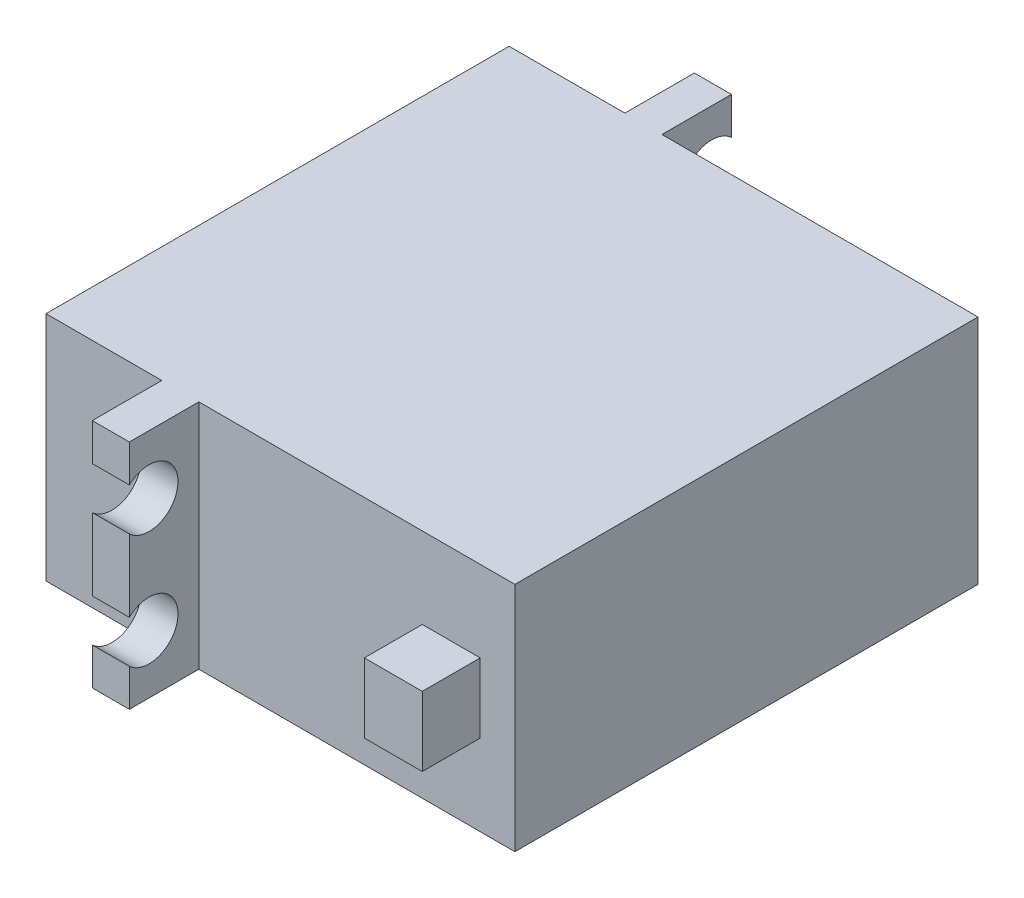
ISO-10303-21;
HEADER;
FILE_DESCRIPTION(('STEP AP214'),'2;1');
FILE_NAME('part.step','',(''),(''),'','','');
FILE_SCHEMA(('AUTOMOTIVE_DESIGN { 1 0 10303 214 1 1 1 1 }'));
ENDSEC;
DATA;
#1=APPLICATION_CONTEXT('core data for automotive mechanical design processes');
#2=APPLICATION_PROTOCOL_DEFINITION('international standard','automotive_design',2000,#1);
#3=PRODUCT_CONTEXT('',#1,'mechanical');
#4=PRODUCT('Part','Part','',(#3));
#5=PRODUCT_RELATED_PRODUCT_CATEGORY('part','',(#4));
#6=PRODUCT_DEFINITION_FORMATION('','',#4);
#7=PRODUCT_DEFINITION_CONTEXT('part definition',#1,'design');
#8=PRODUCT_DEFINITION('design','',#6,#7);
#9=PRODUCT_DEFINITION_SHAPE('','',#8);
#10=(LENGTH_UNIT() NAMED_UNIT(*) SI_UNIT(.MILLI.,.METRE.));
#11=(NAMED_UNIT(*) PLANE_ANGLE_UNIT() SI_UNIT($,.RADIAN.));
#12=(NAMED_UNIT(*) SI_UNIT($,.STERADIAN.) SOLID_ANGLE_UNIT());
#13=UNCERTAINTY_MEASURE_WITH_UNIT(LENGTH_MEASURE(1.E-05),#10,'distance_accuracy_value','');
#14=(GEOMETRIC_REPRESENTATION_CONTEXT(3) GLOBAL_UNCERTAINTY_ASSIGNED_CONTEXT((#13)) GLOBAL_UNIT_ASSIGNED_CONTEXT((#10,
#11,#12)) REPRESENTATION_CONTEXT('',''));
#15=CARTESIAN_POINT('',(0.,0.,0.));
#16=DIRECTION('',(0.,0.,1.));
#17=DIRECTION('',(1.,0.,0.));
#18=AXIS2_PLACEMENT_3D('',#15,#16,#17);
#19=CARTESIAN_POINT('',(-20.25,0.,20.));
#20=DIRECTION('',(0.,0.,-1.));
#21=DIRECTION('',(-1.,0.,0.));
#22=AXIS2_PLACEMENT_3D('',#19,#20,#21);
#23=PLANE('',#22);
#24=DIRECTION('',(0.,1.,0.));
#25=VECTOR('',#24,1.);
#26=CARTESIAN_POINT('',(-7.04999999999999,0.,20.));
#27=LINE('',#26,#25);
#28=CARTESIAN_POINT('',(-7.04999999999999,-10.,20.));
#29=VERTEX_POINT('',#28);
#30=CARTESIAN_POINT('',(-7.04999999999999,10.,20.));
#31=VERTEX_POINT('',#30);
#32=EDGE_CURVE('E311',#29,#31,#27,.T.);
#33=ORIENTED_EDGE('',*,*,#32,.F.);
#34=DIRECTION('',(1.,0.,0.));
#35=VECTOR('',#34,1.);
#36=CARTESIAN_POINT('',(-20.25,-10.,20.));
#37=LINE('',#36,#35);
#38=CARTESIAN_POINT('',(20.25,-10.,20.));
#39=VERTEX_POINT('',#38);
#40=EDGE_CURVE('E46',#29,#39,#37,.T.);
#41=ORIENTED_EDGE('',*,*,#40,.T.);
#42=DIRECTION('',(0.,1.,0.));
#43=VECTOR('',#42,1.);
#44=CARTESIAN_POINT('',(20.25,0.,20.));
#45=LINE('',#44,#43);
#46=CARTESIAN_POINT('',(20.25,10.,20.));
#47=VERTEX_POINT('',#46);
#48=EDGE_CURVE('E337',#39,#47,#45,.T.);
#49=ORIENTED_EDGE('',*,*,#48,.T.);
#50=DIRECTION('',(1.,0.,0.));
#51=VECTOR('',#50,1.);
#52=CARTESIAN_POINT('',(-20.25,10.,20.));
#53=LINE('',#52,#51);
#54=EDGE_CURVE('E357',#31,#47,#53,.T.);
#55=ORIENTED_EDGE('',*,*,#54,.F.);
#56=EDGE_LOOP('',(#33,#41,#49,#55));
#57=FACE_BOUND('',#56,.T.);
#58=DIRECTION('',(0.,-1.,0.));
#59=VECTOR('',#58,1.);
#60=CARTESIAN_POINT('',(12.25,3.,20.));
#61=LINE('',#60,#59);
#62=CARTESIAN_POINT('',(12.25,3.,20.));
#63=VERTEX_POINT('',#62);
#64=CARTESIAN_POINT('',(12.25,-3.,20.));
#65=VERTEX_POINT('',#64);
#66=EDGE_CURVE('E220',#63,#65,#61,.T.);
#67=ORIENTED_EDGE('',*,*,#66,.F.);
#68=DIRECTION('',(-1.,0.,0.));
#69=VECTOR('',#68,1.);
#70=CARTESIAN_POINT('',(12.25,3.,20.));
#71=LINE('',#70,#69);
#72=CARTESIAN_POINT('',(17.25,3.,20.));
#73=VERTEX_POINT('',#72);
#74=EDGE_CURVE('E217',#73,#63,#71,.T.);
#75=ORIENTED_EDGE('',*,*,#74,.F.);
#76=DIRECTION('',(0.,1.,0.));
#77=VECTOR('',#76,1.);
#78=CARTESIAN_POINT('',(17.25,3.,20.));
#79=LINE('',#78,#77);
#80=CARTESIAN_POINT('',(17.25,-3.,20.));
#81=VERTEX_POINT('',#80);
#82=EDGE_CURVE('E59',#81,#73,#79,.T.);
#83=ORIENTED_EDGE('',*,*,#82,.F.);
#84=DIRECTION('',(1.,0.,0.));
#85=VECTOR('',#84,1.);
#86=CARTESIAN_POINT('',(12.25,-3.,20.));
#87=LINE('',#86,#85);
#88=EDGE_CURVE('E54',#65,#81,#87,.T.);
#89=ORIENTED_EDGE('',*,*,#88,.F.);
#90=EDGE_LOOP('',(#67,#75,#83,#89));
#91=FACE_BOUND('',#90,.T.);
#92=ADVANCED_FACE('F37',(#57,#91),#23,.F.);
#93=CARTESIAN_POINT('',(-20.25,0.,-20.));
#94=DIRECTION('',(0.,0.,-1.));
#95=DIRECTION('',(-1.,0.,0.));
#96=AXIS2_PLACEMENT_3D('',#93,#94,#95);
#97=PLANE('',#96);
#98=DIRECTION('',(1.,0.,0.));
#99=VECTOR('',#98,1.);
#100=CARTESIAN_POINT('',(-20.25,-10.,-20.));
#101=LINE('',#100,#99);
#102=CARTESIAN_POINT('',(-7.04999999999999,-10.,-20.));
#103=VERTEX_POINT('',#102);
#104=CARTESIAN_POINT('',(20.25,-10.,-20.));
#105=VERTEX_POINT('',#104);
#106=EDGE_CURVE('E344',#103,#105,#101,.T.);
#107=ORIENTED_EDGE('',*,*,#106,.F.);
#108=DIRECTION('',(0.,1.,0.));
#109=VECTOR('',#108,1.);
#110=CARTESIAN_POINT('',(-7.04999999999999,0.,-20.));
#111=LINE('',#110,#109);
#112=CARTESIAN_POINT('',(-7.04999999999999,10.,-20.));
#113=VERTEX_POINT('',#112);
#114=EDGE_CURVE('E266',#103,#113,#111,.T.);
#115=ORIENTED_EDGE('',*,*,#114,.T.);
#116=DIRECTION('',(1.,0.,0.));
#117=VECTOR('',#116,1.);
#118=CARTESIAN_POINT('',(-20.25,10.,-20.));
#119=LINE('',#118,#117);
#120=CARTESIAN_POINT('',(20.25,10.,-20.));
#121=VERTEX_POINT('',#120);
#122=EDGE_CURVE('E359',#113,#121,#119,.T.);
#123=ORIENTED_EDGE('',*,*,#122,.T.);
#124=DIRECTION('',(0.,1.,0.));
#125=VECTOR('',#124,1.);
#126=CARTESIAN_POINT('',(20.25,0.,-20.));
#127=LINE('',#126,#125);
#128=EDGE_CURVE('E347',#105,#121,#127,.T.);
#129=ORIENTED_EDGE('',*,*,#128,.F.);
#130=EDGE_LOOP('',(#107,#115,#123,#129));
#131=FACE_BOUND('',#130,.T.);
#132=ADVANCED_FACE('F370',(#131),#97,.T.);
#133=CARTESIAN_POINT('',(-20.25,-10.,0.));
#134=DIRECTION('',(0.,-1.,0.));
#135=DIRECTION('',(0.,0.,-1.));
#136=AXIS2_PLACEMENT_3D('',#133,#134,#135);
#137=PLANE('',#136);
#138=DIRECTION('',(0.,0.,-1.));
#139=VECTOR('',#138,1.);
#140=CARTESIAN_POINT('',(20.25,-10.,0.));
#141=LINE('',#140,#139);
#142=EDGE_CURVE('E322',#39,#105,#141,.T.);
#143=ORIENTED_EDGE('',*,*,#142,.F.);
#144=ORIENTED_EDGE('',*,*,#40,.F.);
#145=DIRECTION('',(0.,0.,-1.));
#146=VECTOR('',#145,1.);
#147=CARTESIAN_POINT('',(-7.04999999999999,-10.,0.));
#148=LINE('',#147,#146);
#149=CARTESIAN_POINT('',(-7.04999999999999,-10.,26.));
#150=VERTEX_POINT('',#149);
#151=EDGE_CURVE('E308',#150,#29,#148,.T.);
#152=ORIENTED_EDGE('',*,*,#151,.F.);
#153=DIRECTION('',(1.,0.,0.));
#154=VECTOR('',#153,1.);
#155=CARTESIAN_POINT('',(-10.25,-10.,26.));
#156=LINE('',#155,#154);
#157=CARTESIAN_POINT('',(-10.25,-10.,26.));
#158=VERTEX_POINT('',#157);
#159=EDGE_CURVE('E329',#158,#150,#156,.T.);
#160=ORIENTED_EDGE('',*,*,#159,.F.);
#161=DIRECTION('',(0.,0.,-1.));
#162=VECTOR('',#161,1.);
#163=CARTESIAN_POINT('',(-10.25,-10.,0.));
#164=LINE('',#163,#162);
#165=CARTESIAN_POINT('',(-10.25,-10.,20.));
#166=VERTEX_POINT('',#165);
#167=EDGE_CURVE('E290',#158,#166,#164,.T.);
#168=ORIENTED_EDGE('',*,*,#167,.T.);
#169=CARTESIAN_POINT('',(-20.25,-10.,20.));
#170=VERTEX_POINT('',#169);
#171=EDGE_CURVE('E11',#170,#166,#37,.T.);
#172=ORIENTED_EDGE('',*,*,#171,.F.);
#173=DIRECTION('',(0.,0.,-1.));
#174=VECTOR('',#173,1.);
#175=CARTESIAN_POINT('',(-20.25,-10.,0.));
#176=LINE('',#175,#174);
#177=CARTESIAN_POINT('',(-20.25,-10.,-20.));
#178=VERTEX_POINT('',#177);
#179=EDGE_CURVE('E333',#170,#178,#176,.T.);
#180=ORIENTED_EDGE('',*,*,#179,.T.);
#181=CARTESIAN_POINT('',(-10.25,-10.,-20.));
#182=VERTEX_POINT('',#181);
#183=EDGE_CURVE('E41',#178,#182,#101,.T.);
#184=ORIENTED_EDGE('',*,*,#183,.T.);
#185=DIRECTION('',(0.,0.,1.));
#186=VECTOR('',#185,1.);
#187=CARTESIAN_POINT('',(-10.25,-9.99999999999999,0.));
#188=LINE('',#187,#186);
#189=CARTESIAN_POINT('',(-10.25,-10.,-26.));
#190=VERTEX_POINT('',#189);
#191=EDGE_CURVE('E250',#190,#182,#188,.T.);
#192=ORIENTED_EDGE('',*,*,#191,.F.);
#193=DIRECTION('',(1.,0.,0.));
#194=VECTOR('',#193,1.);
#195=CARTESIAN_POINT('',(-10.25,-10.,-26.));
#196=LINE('',#195,#194);
#197=CARTESIAN_POINT('',(-7.04999999999999,-10.,-26.));
#198=VERTEX_POINT('',#197);
#199=EDGE_CURVE('E270',#190,#198,#196,.T.);
#200=ORIENTED_EDGE('',*,*,#199,.T.);
#201=DIRECTION('',(0.,0.,1.));
#202=VECTOR('',#201,1.);
#203=CARTESIAN_POINT('',(-7.04999999999999,-9.99999999999999,0.));
#204=LINE('',#203,#202);
#205=EDGE_CURVE('E237',#198,#103,#204,.T.);
#206=ORIENTED_EDGE('',*,*,#205,.T.);
#207=ORIENTED_EDGE('',*,*,#106,.T.);
#208=EDGE_LOOP('',(#143,#144,#152,#160,#168,#172,#180,#184,#192,#200,#206,#207));
#209=FACE_BOUND('',#208,.T.);
#210=ADVANCED_FACE('F39',(#209),#137,.T.);
#211=ORIENTED_EDGE('',*,*,#171,.T.);
#212=DIRECTION('',(0.,1.,0.));
#213=VECTOR('',#212,1.);
#214=CARTESIAN_POINT('',(-10.25,0.,20.));
#215=LINE('',#214,#213);
#216=CARTESIAN_POINT('',(-10.25,10.,20.));
#217=VERTEX_POINT('',#216);
#218=EDGE_CURVE('E295',#166,#217,#215,.T.);
#219=ORIENTED_EDGE('',*,*,#218,.T.);
#220=CARTESIAN_POINT('',(-20.25,10.,20.));
#221=VERTEX_POINT('',#220);
#222=EDGE_CURVE('E355',#221,#217,#53,.T.);
#223=ORIENTED_EDGE('',*,*,#222,.F.);
#224=DIRECTION('',(0.,1.,0.));
#225=VECTOR('',#224,1.);
#226=CARTESIAN_POINT('',(-20.25,0.,20.));
#227=LINE('',#226,#225);
#228=EDGE_CURVE('E342',#170,#221,#227,.T.);
#229=ORIENTED_EDGE('',*,*,#228,.F.);
#230=EDGE_LOOP('',(#211,#219,#223,#229));
#231=FACE_BOUND('',#230,.T.);
#232=ADVANCED_FACE('F395',(#231),#23,.F.);
#233=CARTESIAN_POINT('',(-20.25,10.,0.));
#234=DIRECTION('',(0.,-1.,0.));
#235=DIRECTION('',(0.,0.,-1.));
#236=AXIS2_PLACEMENT_3D('',#233,#234,#235);
#237=PLANE('',#236);
#238=DIRECTION('',(0.,0.,-1.));
#239=VECTOR('',#238,1.);
#240=CARTESIAN_POINT('',(20.25,10.,0.));
#241=LINE('',#240,#239);
#242=EDGE_CURVE('E350',#47,#121,#241,.T.);
#243=ORIENTED_EDGE('',*,*,#242,.T.);
#244=ORIENTED_EDGE('',*,*,#122,.F.);
#245=DIRECTION('',(0.,0.,-1.));
#246=VECTOR('',#245,1.);
#247=CARTESIAN_POINT('',(-7.04999999999999,10.,0.));
#248=LINE('',#247,#246);
#249=CARTESIAN_POINT('',(-7.04999999999999,10.,-26.));
#250=VERTEX_POINT('',#249);
#251=EDGE_CURVE('E264',#113,#250,#248,.T.);
#252=ORIENTED_EDGE('',*,*,#251,.T.);
#253=DIRECTION('',(1.,0.,0.));
#254=VECTOR('',#253,1.);
#255=CARTESIAN_POINT('',(-10.25,10.,-26.));
#256=LINE('',#255,#254);
#257=CARTESIAN_POINT('',(-10.25,10.,-26.));
#258=VERTEX_POINT('',#257);
#259=EDGE_CURVE('E274',#258,#250,#256,.T.);
#260=ORIENTED_EDGE('',*,*,#259,.F.);
#261=DIRECTION('',(0.,0.,-1.));
#262=VECTOR('',#261,1.);
#263=CARTESIAN_POINT('',(-10.25,10.,0.));
#264=LINE('',#263,#262);
#265=CARTESIAN_POINT('',(-10.25,10.,-20.));
#266=VERTEX_POINT('',#265);
#267=EDGE_CURVE('E245',#266,#258,#264,.T.);
#268=ORIENTED_EDGE('',*,*,#267,.F.);
#269=CARTESIAN_POINT('',(-20.25,10.,-20.));
#270=VERTEX_POINT('',#269);
#271=EDGE_CURVE('E358',#270,#266,#119,.T.);
#272=ORIENTED_EDGE('',*,*,#271,.F.);
#273=DIRECTION('',(0.,0.,-1.));
#274=VECTOR('',#273,1.);
#275=CARTESIAN_POINT('',(-20.25,10.,0.));
#276=LINE('',#275,#274);
#277=EDGE_CURVE('E340',#221,#270,#276,.T.);
#278=ORIENTED_EDGE('',*,*,#277,.F.);
#279=ORIENTED_EDGE('',*,*,#222,.T.);
#280=DIRECTION('',(0.,0.,1.));
#281=VECTOR('',#280,1.);
#282=CARTESIAN_POINT('',(-10.25,10.,0.));
#283=LINE('',#282,#281);
#284=CARTESIAN_POINT('',(-10.25,10.,26.));
#285=VERTEX_POINT('',#284);
#286=EDGE_CURVE('E298',#217,#285,#283,.T.);
#287=ORIENTED_EDGE('',*,*,#286,.T.);
#288=DIRECTION('',(1.,0.,0.));
#289=VECTOR('',#288,1.);
#290=CARTESIAN_POINT('',(-10.25,10.,26.));
#291=LINE('',#290,#289);
#292=CARTESIAN_POINT('',(-7.04999999999999,10.,26.));
#293=VERTEX_POINT('',#292);
#294=EDGE_CURVE('E327',#285,#293,#291,.T.);
#295=ORIENTED_EDGE('',*,*,#294,.T.);
#296=DIRECTION('',(0.,0.,1.));
#297=VECTOR('',#296,1.);
#298=CARTESIAN_POINT('',(-7.04999999999999,10.,0.));
#299=LINE('',#298,#297);
#300=EDGE_CURVE('E314',#31,#293,#299,.T.);
#301=ORIENTED_EDGE('',*,*,#300,.F.);
#302=ORIENTED_EDGE('',*,*,#54,.T.);
#303=EDGE_LOOP('',(#243,#244,#252,#260,#268,#272,#278,#279,#287,#295,#301,#302));
#304=FACE_BOUND('',#303,.T.);
#305=ADVANCED_FACE('F408',(#304),#237,.F.);
#306=DIRECTION('',(0.,1.,0.));
#307=VECTOR('',#306,1.);
#308=CARTESIAN_POINT('',(-10.25,0.,-20.));
#309=LINE('',#308,#307);
#310=EDGE_CURVE('E247',#182,#266,#309,.T.);
#311=ORIENTED_EDGE('',*,*,#310,.F.);
#312=ORIENTED_EDGE('',*,*,#183,.F.);
#313=DIRECTION('',(0.,1.,0.));
#314=VECTOR('',#313,1.);
#315=CARTESIAN_POINT('',(-20.25,0.,-20.));
#316=LINE('',#315,#314);
#317=EDGE_CURVE('E336',#178,#270,#316,.T.);
#318=ORIENTED_EDGE('',*,*,#317,.T.);
#319=ORIENTED_EDGE('',*,*,#271,.T.);
#320=EDGE_LOOP('',(#311,#312,#318,#319));
#321=FACE_BOUND('',#320,.T.);
#322=ADVANCED_FACE('F402',(#321),#97,.T.);
#323=CARTESIAN_POINT('',(-20.25,0.,0.));
#324=DIRECTION('',(1.,0.,0.));
#325=DIRECTION('',(0.,0.,-1.));
#326=AXIS2_PLACEMENT_3D('',#323,#324,#325);
#327=PLANE('',#326);
#328=CARTESIAN_POINT('',(-20.25,0.,10.2));
#329=DIRECTION('',(1.,0.,0.));
#330=DIRECTION('',(0.,0.,-1.));
#331=AXIS2_PLACEMENT_3D('',#328,#329,#330);
#332=CIRCLE('',#331,3.);
#333=CARTESIAN_POINT('',(-20.25,0.,7.2));
#334=VERTEX_POINT('',#333);
#335=EDGE_CURVE('E221',#334,#334,#332,.T.);
#336=ORIENTED_EDGE('',*,*,#335,.T.);
#337=EDGE_LOOP('',(#336));
#338=FACE_BOUND('',#337,.T.);
#339=ORIENTED_EDGE('',*,*,#179,.F.);
#340=ORIENTED_EDGE('',*,*,#228,.T.);
#341=ORIENTED_EDGE('',*,*,#277,.T.);
#342=ORIENTED_EDGE('',*,*,#317,.F.);
#343=EDGE_LOOP('',(#339,#340,#341,#342));
#344=FACE_BOUND('',#343,.T.);
#345=ADVANCED_FACE('F401',(#338,#344),#327,.F.);
#346=CARTESIAN_POINT('',(20.25,0.,0.));
#347=DIRECTION('',(1.,0.,0.));
#348=DIRECTION('',(0.,0.,-1.));
#349=AXIS2_PLACEMENT_3D('',#346,#347,#348);
#350=PLANE('',#349);
#351=ORIENTED_EDGE('',*,*,#142,.T.);
#352=ORIENTED_EDGE('',*,*,#128,.T.);
#353=ORIENTED_EDGE('',*,*,#242,.F.);
#354=ORIENTED_EDGE('',*,*,#48,.F.);
#355=EDGE_LOOP('',(#351,#352,#353,#354));
#356=FACE_BOUND('',#355,.T.);
#357=ADVANCED_FACE('F374',(#356),#350,.T.);
#358=CARTESIAN_POINT('',(-10.25,-4.95,24.3));
#359=DIRECTION('',(1.,0.,0.));
#360=DIRECTION('',(0.,0.,-1.));
#361=AXIS2_PLACEMENT_3D('',#358,#359,#360);
#362=CYLINDRICAL_SURFACE('',#361,2.5);
#363=CARTESIAN_POINT('',(-7.04999999999999,-4.95,24.3));
#364=DIRECTION('',(1.,0.,0.));
#365=DIRECTION('',(0.,0.,-1.));
#366=AXIS2_PLACEMENT_3D('',#363,#364,#365);
#367=CIRCLE('',#366,2.5);
#368=CARTESIAN_POINT('',(-7.04999999999999,-6.78303027798233,26.));
#369=VERTEX_POINT('',#368);
#370=CARTESIAN_POINT('',(-7.04999999999999,-3.11696972201767,26.));
#371=VERTEX_POINT('',#370);
#372=EDGE_CURVE('E273',#369,#371,#367,.T.);
#373=ORIENTED_EDGE('',*,*,#372,.T.);
#374=DIRECTION('',(1.,0.,0.));
#375=VECTOR('',#374,1.);
#376=CARTESIAN_POINT('',(-10.25,-3.11696972201767,26.));
#377=LINE('',#376,#375);
#378=CARTESIAN_POINT('',(-10.25,-3.11696972201767,26.));
#379=VERTEX_POINT('',#378);
#380=EDGE_CURVE('E320',#379,#371,#377,.T.);
#381=ORIENTED_EDGE('',*,*,#380,.F.);
#382=CARTESIAN_POINT('',(-10.25,-4.95,24.3));
#383=DIRECTION('',(1.,0.,0.));
#384=DIRECTION('',(0.,0.,-1.));
#385=AXIS2_PLACEMENT_3D('',#382,#383,#384);
#386=CIRCLE('',#385,2.5);
#387=CARTESIAN_POINT('',(-10.25,-6.78303027798233,26.));
#388=VERTEX_POINT('',#387);
#389=EDGE_CURVE('E284',#388,#379,#386,.T.);
#390=ORIENTED_EDGE('',*,*,#389,.F.);
#391=DIRECTION('',(1.,0.,0.));
#392=VECTOR('',#391,1.);
#393=CARTESIAN_POINT('',(-10.25,-6.78303027798233,26.));
#394=LINE('',#393,#392);
#395=EDGE_CURVE('E331',#388,#369,#394,.T.);
#396=ORIENTED_EDGE('',*,*,#395,.T.);
#397=EDGE_LOOP('',(#373,#381,#390,#396));
#398=FACE_BOUND('',#397,.T.);
#399=ADVANCED_FACE('F444',(#398),#362,.F.);
#400=CARTESIAN_POINT('',(-10.25,0.,26.));
#401=DIRECTION('',(0.,0.,1.));
#402=DIRECTION('',(0.,-1.,0.));
#403=AXIS2_PLACEMENT_3D('',#400,#401,#402);
#404=PLANE('',#403);
#405=DIRECTION('',(0.,-1.,0.));
#406=VECTOR('',#405,1.);
#407=CARTESIAN_POINT('',(-7.04999999999999,0.,26.));
#408=LINE('',#407,#406);
#409=CARTESIAN_POINT('',(-7.04999999999999,3.11696972201767,26.));
#410=VERTEX_POINT('',#409);
#411=EDGE_CURVE('E287',#410,#371,#408,.T.);
#412=ORIENTED_EDGE('',*,*,#411,.F.);
#413=DIRECTION('',(1.,0.,0.));
#414=VECTOR('',#413,1.);
#415=CARTESIAN_POINT('',(-10.25,3.11696972201767,26.));
#416=LINE('',#415,#414);
#417=CARTESIAN_POINT('',(-10.25,3.11696972201767,26.));
#418=VERTEX_POINT('',#417);
#419=EDGE_CURVE('E323',#418,#410,#416,.T.);
#420=ORIENTED_EDGE('',*,*,#419,.F.);
#421=DIRECTION('',(0.,-1.,0.));
#422=VECTOR('',#421,1.);
#423=CARTESIAN_POINT('',(-10.25,0.,26.));
#424=LINE('',#423,#422);
#425=EDGE_CURVE('E291',#418,#379,#424,.T.);
#426=ORIENTED_EDGE('',*,*,#425,.T.);
#427=ORIENTED_EDGE('',*,*,#380,.T.);
#428=EDGE_LOOP('',(#412,#420,#426,#427));
#429=FACE_BOUND('',#428,.T.);
#430=ADVANCED_FACE('F440',(#429),#404,.T.);
#431=CARTESIAN_POINT('',(-10.25,4.95,24.3));
#432=DIRECTION('',(1.,0.,0.));
#433=DIRECTION('',(0.,0.,-1.));
#434=AXIS2_PLACEMENT_3D('',#431,#432,#433);
#435=CYLINDRICAL_SURFACE('',#434,2.5);
#436=CARTESIAN_POINT('',(-7.04999999999999,4.95,24.3));
#437=DIRECTION('',(1.,0.,0.));
#438=DIRECTION('',(0.,0.,-1.));
#439=AXIS2_PLACEMENT_3D('',#436,#437,#438);
#440=CIRCLE('',#439,2.5);
#441=CARTESIAN_POINT('',(-7.04999999999999,6.78303027798234,26.));
#442=VERTEX_POINT('',#441);
#443=EDGE_CURVE('E317',#410,#442,#440,.T.);
#444=ORIENTED_EDGE('',*,*,#443,.T.);
#445=DIRECTION('',(1.,0.,0.));
#446=VECTOR('',#445,1.);
#447=CARTESIAN_POINT('',(-10.25,6.78303027798234,26.));
#448=LINE('',#447,#446);
#449=CARTESIAN_POINT('',(-10.25,6.78303027798234,26.));
#450=VERTEX_POINT('',#449);
#451=EDGE_CURVE('E325',#450,#442,#448,.T.);
#452=ORIENTED_EDGE('',*,*,#451,.F.);
#453=CARTESIAN_POINT('',(-10.25,4.95,24.3));
#454=DIRECTION('',(1.,0.,0.));
#455=DIRECTION('',(0.,0.,-1.));
#456=AXIS2_PLACEMENT_3D('',#453,#454,#455);
#457=CIRCLE('',#456,2.5);
#458=EDGE_CURVE('E301',#418,#450,#457,.T.);
#459=ORIENTED_EDGE('',*,*,#458,.F.);
#460=ORIENTED_EDGE('',*,*,#419,.T.);
#461=EDGE_LOOP('',(#444,#452,#459,#460));
#462=FACE_BOUND('',#461,.T.);
#463=ADVANCED_FACE('F451',(#462),#435,.F.);
#464=EDGE_CURVE('E309',#293,#442,#408,.T.);
#465=ORIENTED_EDGE('',*,*,#464,.F.);
#466=ORIENTED_EDGE('',*,*,#294,.F.);
#467=EDGE_CURVE('E292',#285,#450,#424,.T.);
#468=ORIENTED_EDGE('',*,*,#467,.T.);
#469=ORIENTED_EDGE('',*,*,#451,.T.);
#470=EDGE_LOOP('',(#465,#466,#468,#469));
#471=FACE_BOUND('',#470,.T.);
#472=ADVANCED_FACE('F453',(#471),#404,.T.);
#473=EDGE_CURVE('E305',#369,#150,#408,.T.);
#474=ORIENTED_EDGE('',*,*,#473,.F.);
#475=ORIENTED_EDGE('',*,*,#395,.F.);
#476=EDGE_CURVE('E286',#388,#158,#424,.T.);
#477=ORIENTED_EDGE('',*,*,#476,.T.);
#478=ORIENTED_EDGE('',*,*,#159,.T.);
#479=EDGE_LOOP('',(#474,#475,#477,#478));
#480=FACE_BOUND('',#479,.T.);
#481=ADVANCED_FACE('F386',(#480),#404,.T.);
#482=CARTESIAN_POINT('',(-10.25,0.,0.));
#483=DIRECTION('',(1.,0.,0.));
#484=DIRECTION('',(0.,0.,-1.));
#485=AXIS2_PLACEMENT_3D('',#482,#483,#484);
#486=PLANE('',#485);
#487=ORIENTED_EDGE('',*,*,#389,.T.);
#488=ORIENTED_EDGE('',*,*,#425,.F.);
#489=ORIENTED_EDGE('',*,*,#458,.T.);
#490=ORIENTED_EDGE('',*,*,#467,.F.);
#491=ORIENTED_EDGE('',*,*,#286,.F.);
#492=ORIENTED_EDGE('',*,*,#218,.F.);
#493=ORIENTED_EDGE('',*,*,#167,.F.);
#494=ORIENTED_EDGE('',*,*,#476,.F.);
#495=EDGE_LOOP('',(#487,#488,#489,#490,#491,#492,#493,#494));
#496=FACE_BOUND('',#495,.T.);
#497=ADVANCED_FACE('F390',(#496),#486,.F.);
#498=CARTESIAN_POINT('',(-7.04999999999999,0.,0.));
#499=DIRECTION('',(1.,0.,0.));
#500=DIRECTION('',(0.,0.,-1.));
#501=AXIS2_PLACEMENT_3D('',#498,#499,#500);
#502=PLANE('',#501);
#503=ORIENTED_EDGE('',*,*,#372,.F.);
#504=ORIENTED_EDGE('',*,*,#473,.T.);
#505=ORIENTED_EDGE('',*,*,#151,.T.);
#506=ORIENTED_EDGE('',*,*,#32,.T.);
#507=ORIENTED_EDGE('',*,*,#300,.T.);
#508=ORIENTED_EDGE('',*,*,#464,.T.);
#509=ORIENTED_EDGE('',*,*,#443,.F.);
#510=ORIENTED_EDGE('',*,*,#411,.T.);
#511=EDGE_LOOP('',(#503,#504,#505,#506,#507,#508,#509,#510));
#512=FACE_BOUND('',#511,.T.);
#513=ADVANCED_FACE('F383',(#512),#502,.T.);
#514=CARTESIAN_POINT('',(-10.25,0.,-26.));
#515=DIRECTION('',(0.,0.,1.));
#516=DIRECTION('',(0.,-1.,0.));
#517=AXIS2_PLACEMENT_3D('',#514,#515,#516);
#518=PLANE('',#517);
#519=DIRECTION('',(0.,-1.,0.));
#520=VECTOR('',#519,1.);
#521=CARTESIAN_POINT('',(-7.04999999999999,0.,-26.));
#522=LINE('',#521,#520);
#523=CARTESIAN_POINT('',(-7.04999999999999,-6.78303027798234,-26.));
#524=VERTEX_POINT('',#523);
#525=EDGE_CURVE('E231',#524,#198,#522,.T.);
#526=ORIENTED_EDGE('',*,*,#525,.T.);
#527=ORIENTED_EDGE('',*,*,#199,.F.);
#528=DIRECTION('',(0.,-1.,0.));
#529=VECTOR('',#528,1.);
#530=CARTESIAN_POINT('',(-10.25,0.,-26.));
#531=LINE('',#530,#529);
#532=CARTESIAN_POINT('',(-10.25,-6.78303027798234,-26.));
#533=VERTEX_POINT('',#532);
#534=EDGE_CURVE('E233',#533,#190,#531,.T.);
#535=ORIENTED_EDGE('',*,*,#534,.F.);
#536=DIRECTION('',(1.,0.,0.));
#537=VECTOR('',#536,1.);
#538=CARTESIAN_POINT('',(-10.25,-6.78303027798234,-26.));
#539=LINE('',#538,#537);
#540=EDGE_CURVE('E253',#533,#524,#539,.T.);
#541=ORIENTED_EDGE('',*,*,#540,.T.);
#542=EDGE_LOOP('',(#526,#527,#535,#541));
#543=FACE_BOUND('',#542,.T.);
#544=ADVANCED_FACE('F431',(#543),#518,.F.);
#545=CARTESIAN_POINT('',(-7.04999999999999,6.78303027798234,-26.));
#546=VERTEX_POINT('',#545);
#547=EDGE_CURVE('E257',#250,#546,#522,.T.);
#548=ORIENTED_EDGE('',*,*,#547,.T.);
#549=DIRECTION('',(1.,0.,0.));
#550=VECTOR('',#549,1.);
#551=CARTESIAN_POINT('',(-10.25,6.78303027798234,-26.));
#552=LINE('',#551,#550);
#553=CARTESIAN_POINT('',(-10.25,6.78303027798234,-26.));
#554=VERTEX_POINT('',#553);
#555=EDGE_CURVE('E277',#554,#546,#552,.T.);
#556=ORIENTED_EDGE('',*,*,#555,.F.);
#557=EDGE_CURVE('E238',#258,#554,#531,.T.);
#558=ORIENTED_EDGE('',*,*,#557,.F.);
#559=ORIENTED_EDGE('',*,*,#259,.T.);
#560=EDGE_LOOP('',(#548,#556,#558,#559));
#561=FACE_BOUND('',#560,.T.);
#562=ADVANCED_FACE('F415',(#561),#518,.F.);
#563=CARTESIAN_POINT('',(-10.25,4.95,-24.3));
#564=DIRECTION('',(1.,0.,0.));
#565=DIRECTION('',(0.,0.,-1.));
#566=AXIS2_PLACEMENT_3D('',#563,#564,#565);
#567=CYLINDRICAL_SURFACE('',#566,2.5);
#568=CARTESIAN_POINT('',(-7.04999999999999,4.95,-24.3));
#569=DIRECTION('',(1.,0.,0.));
#570=DIRECTION('',(0.,0.,-1.));
#571=AXIS2_PLACEMENT_3D('',#568,#569,#570);
#572=CIRCLE('',#571,2.5);
#573=CARTESIAN_POINT('',(-7.04999999999999,3.11696972201767,-26.));
#574=VERTEX_POINT('',#573);
#575=EDGE_CURVE('E261',#574,#546,#572,.F.);
#576=ORIENTED_EDGE('',*,*,#575,.F.);
#577=DIRECTION('',(1.,0.,0.));
#578=VECTOR('',#577,1.);
#579=CARTESIAN_POINT('',(-10.25,3.11696972201767,-26.));
#580=LINE('',#579,#578);
#581=CARTESIAN_POINT('',(-10.25,3.11696972201767,-26.));
#582=VERTEX_POINT('',#581);
#583=EDGE_CURVE('E279',#582,#574,#580,.T.);
#584=ORIENTED_EDGE('',*,*,#583,.F.);
#585=CARTESIAN_POINT('',(-10.25,4.95,-24.3));
#586=DIRECTION('',(1.,0.,0.));
#587=DIRECTION('',(0.,0.,-1.));
#588=AXIS2_PLACEMENT_3D('',#585,#586,#587);
#589=CIRCLE('',#588,2.5);
#590=EDGE_CURVE('E242',#582,#554,#589,.F.);
#591=ORIENTED_EDGE('',*,*,#590,.T.);
#592=ORIENTED_EDGE('',*,*,#555,.T.);
#593=EDGE_LOOP('',(#576,#584,#591,#592));
#594=FACE_BOUND('',#593,.T.);
#595=ADVANCED_FACE('F580',(#594),#567,.F.);
#596=CARTESIAN_POINT('',(-7.04999999999999,-3.11696972201767,-26.));
#597=VERTEX_POINT('',#596);
#598=EDGE_CURVE('E258',#574,#597,#522,.T.);
#599=ORIENTED_EDGE('',*,*,#598,.T.);
#600=DIRECTION('',(1.,0.,0.));
#601=VECTOR('',#600,1.);
#602=CARTESIAN_POINT('',(-10.25,-3.11696972201767,-26.));
#603=LINE('',#602,#601);
#604=CARTESIAN_POINT('',(-10.25,-3.11696972201767,-26.));
#605=VERTEX_POINT('',#604);
#606=EDGE_CURVE('E281',#605,#597,#603,.T.);
#607=ORIENTED_EDGE('',*,*,#606,.F.);
#608=EDGE_CURVE('E239',#582,#605,#531,.T.);
#609=ORIENTED_EDGE('',*,*,#608,.F.);
#610=ORIENTED_EDGE('',*,*,#583,.T.);
#611=EDGE_LOOP('',(#599,#607,#609,#610));
#612=FACE_BOUND('',#611,.T.);
#613=ADVANCED_FACE('F422',(#612),#518,.F.);
#614=CARTESIAN_POINT('',(-10.25,-4.95,-24.3));
#615=DIRECTION('',(1.,0.,0.));
#616=DIRECTION('',(0.,0.,-1.));
#617=AXIS2_PLACEMENT_3D('',#614,#615,#616);
#618=CYLINDRICAL_SURFACE('',#617,2.5);
#619=CARTESIAN_POINT('',(-7.04999999999999,-4.95,-24.3));
#620=DIRECTION('',(1.,0.,0.));
#621=DIRECTION('',(0.,0.,-1.));
#622=AXIS2_PLACEMENT_3D('',#619,#620,#621);
#623=CIRCLE('',#622,2.5);
#624=EDGE_CURVE('E256',#524,#597,#623,.F.);
#625=ORIENTED_EDGE('',*,*,#624,.F.);
#626=ORIENTED_EDGE('',*,*,#540,.F.);
#627=CARTESIAN_POINT('',(-10.25,-4.95,-24.3));
#628=DIRECTION('',(1.,0.,0.));
#629=DIRECTION('',(0.,0.,-1.));
#630=AXIS2_PLACEMENT_3D('',#627,#628,#629);
#631=CIRCLE('',#630,2.5);
#632=EDGE_CURVE('E236',#533,#605,#631,.F.);
#633=ORIENTED_EDGE('',*,*,#632,.T.);
#634=ORIENTED_EDGE('',*,*,#606,.T.);
#635=EDGE_LOOP('',(#625,#626,#633,#634));
#636=FACE_BOUND('',#635,.T.);
#637=ADVANCED_FACE('F426',(#636),#618,.F.);
#638=CARTESIAN_POINT('',(-10.25,0.,0.));
#639=DIRECTION('',(1.,0.,0.));
#640=DIRECTION('',(0.,0.,-1.));
#641=AXIS2_PLACEMENT_3D('',#638,#639,#640);
#642=PLANE('',#641);
#643=ORIENTED_EDGE('',*,*,#534,.T.);
#644=ORIENTED_EDGE('',*,*,#191,.T.);
#645=ORIENTED_EDGE('',*,*,#310,.T.);
#646=ORIENTED_EDGE('',*,*,#267,.T.);
#647=ORIENTED_EDGE('',*,*,#557,.T.);
#648=ORIENTED_EDGE('',*,*,#590,.F.);
#649=ORIENTED_EDGE('',*,*,#608,.T.);
#650=ORIENTED_EDGE('',*,*,#632,.F.);
#651=EDGE_LOOP('',(#643,#644,#645,#646,#647,#648,#649,#650));
#652=FACE_BOUND('',#651,.T.);
#653=ADVANCED_FACE('F405',(#652),#642,.F.);
#654=CARTESIAN_POINT('',(-7.04999999999999,0.,0.));
#655=DIRECTION('',(1.,0.,0.));
#656=DIRECTION('',(0.,0.,-1.));
#657=AXIS2_PLACEMENT_3D('',#654,#655,#656);
#658=PLANE('',#657);
#659=ORIENTED_EDGE('',*,*,#525,.F.);
#660=ORIENTED_EDGE('',*,*,#624,.T.);
#661=ORIENTED_EDGE('',*,*,#598,.F.);
#662=ORIENTED_EDGE('',*,*,#575,.T.);
#663=ORIENTED_EDGE('',*,*,#547,.F.);
#664=ORIENTED_EDGE('',*,*,#251,.F.);
#665=ORIENTED_EDGE('',*,*,#114,.F.);
#666=ORIENTED_EDGE('',*,*,#205,.F.);
#667=EDGE_LOOP('',(#659,#660,#661,#662,#663,#664,#665,#666));
#668=FACE_BOUND('',#667,.T.);
#669=ADVANCED_FACE('F433',(#668),#658,.T.);
#670=CARTESIAN_POINT('',(-25.75,0.,10.2));
#671=DIRECTION('',(1.,0.,0.));
#672=DIRECTION('',(0.,0.,-1.));
#673=AXIS2_PLACEMENT_3D('',#670,#671,#672);
#674=CYLINDRICAL_SURFACE('',#673,3.);
#675=CARTESIAN_POINT('',(-25.75,0.,10.2));
#676=DIRECTION('',(1.,0.,0.));
#677=DIRECTION('',(0.,0.,-1.));
#678=AXIS2_PLACEMENT_3D('',#675,#676,#677);
#679=CIRCLE('',#678,3.);
#680=CARTESIAN_POINT('',(-25.75,0.,7.2));
#681=VERTEX_POINT('',#680);
#682=EDGE_CURVE('E224',#681,#681,#679,.T.);
#683=ORIENTED_EDGE('',*,*,#682,.T.);
#684=EDGE_LOOP('',(#683));
#685=FACE_BOUND('',#684,.T.);
#686=ORIENTED_EDGE('',*,*,#335,.F.);
#687=EDGE_LOOP('',(#686));
#688=FACE_BOUND('',#687,.T.);
#689=ADVANCED_FACE('F614',(#685,#688),#674,.T.);
#690=CARTESIAN_POINT('',(-25.75,0.,10.2));
#691=DIRECTION('',(1.,0.,0.));
#692=DIRECTION('',(0.,0.,-1.));
#693=AXIS2_PLACEMENT_3D('',#690,#691,#692);
#694=PLANE('',#693);
#695=ORIENTED_EDGE('',*,*,#682,.F.);
#696=EDGE_LOOP('',(#695));
#697=FACE_BOUND('',#696,.T.);
#698=ADVANCED_FACE('F621',(#697),#694,.F.);
#699=CARTESIAN_POINT('',(12.25,3.,25.));
#700=DIRECTION('',(1.,0.,0.));
#701=DIRECTION('',(0.,0.,-1.));
#702=AXIS2_PLACEMENT_3D('',#699,#700,#701);
#703=PLANE('',#702);
#704=ORIENTED_EDGE('',*,*,#66,.T.);
#705=DIRECTION('',(0.,0.,-1.));
#706=VECTOR('',#705,1.);
#707=CARTESIAN_POINT('',(12.25,-3.,25.));
#708=LINE('',#707,#706);
#709=CARTESIAN_POINT('',(12.25,-3.,25.));
#710=VERTEX_POINT('',#709);
#711=EDGE_CURVE('E201',#710,#65,#708,.T.);
#712=ORIENTED_EDGE('',*,*,#711,.F.);
#713=DIRECTION('',(0.,-1.,0.));
#714=VECTOR('',#713,1.);
#715=CARTESIAN_POINT('',(12.25,3.,25.));
#716=LINE('',#715,#714);
#717=CARTESIAN_POINT('',(12.25,3.,25.));
#718=VERTEX_POINT('',#717);
#719=EDGE_CURVE('E208',#718,#710,#716,.T.);
#720=ORIENTED_EDGE('',*,*,#719,.F.);
#721=DIRECTION('',(0.,0.,-1.));
#722=VECTOR('',#721,1.);
#723=CARTESIAN_POINT('',(12.25,3.,25.));
#724=LINE('',#723,#722);
#725=EDGE_CURVE('E697',#718,#63,#724,.T.);
#726=ORIENTED_EDGE('',*,*,#725,.T.);
#727=EDGE_LOOP('',(#704,#712,#720,#726));
#728=FACE_BOUND('',#727,.T.);
#729=ADVANCED_FACE('F219',(#728),#703,.F.);
#730=CARTESIAN_POINT('',(12.25,-3.,25.));
#731=DIRECTION('',(0.,1.,0.));
#732=DIRECTION('',(0.,0.,1.));
#733=AXIS2_PLACEMENT_3D('',#730,#731,#732);
#734=PLANE('',#733);
#735=ORIENTED_EDGE('',*,*,#88,.T.);
#736=DIRECTION('',(0.,0.,-1.));
#737=VECTOR('',#736,1.);
#738=CARTESIAN_POINT('',(17.25,-3.,25.));
#739=LINE('',#738,#737);
#740=CARTESIAN_POINT('',(17.25,-3.,25.));
#741=VERTEX_POINT('',#740);
#742=EDGE_CURVE('E204',#741,#81,#739,.T.);
#743=ORIENTED_EDGE('',*,*,#742,.F.);
#744=DIRECTION('',(1.,0.,0.));
#745=VECTOR('',#744,1.);
#746=CARTESIAN_POINT('',(12.25,-3.,25.));
#747=LINE('',#746,#745);
#748=EDGE_CURVE('E197',#710,#741,#747,.T.);
#749=ORIENTED_EDGE('',*,*,#748,.F.);
#750=ORIENTED_EDGE('',*,*,#711,.T.);
#751=EDGE_LOOP('',(#735,#743,#749,#750));
#752=FACE_BOUND('',#751,.T.);
#753=ADVANCED_FACE('F199',(#752),#734,.F.);
#754=CARTESIAN_POINT('',(17.25,3.,25.));
#755=DIRECTION('',(-1.,0.,0.));
#756=DIRECTION('',(0.,0.,1.));
#757=AXIS2_PLACEMENT_3D('',#754,#755,#756);
#758=PLANE('',#757);
#759=ORIENTED_EDGE('',*,*,#82,.T.);
#760=DIRECTION('',(0.,0.,-1.));
#761=VECTOR('',#760,1.);
#762=CARTESIAN_POINT('',(17.25,3.,25.));
#763=LINE('',#762,#761);
#764=CARTESIAN_POINT('',(17.25,3.,25.));
#765=VERTEX_POINT('',#764);
#766=EDGE_CURVE('E226',#765,#73,#763,.T.);
#767=ORIENTED_EDGE('',*,*,#766,.F.);
#768=DIRECTION('',(0.,1.,0.));
#769=VECTOR('',#768,1.);
#770=CARTESIAN_POINT('',(17.25,3.,25.));
#771=LINE('',#770,#769);
#772=EDGE_CURVE('E207',#741,#765,#771,.T.);
#773=ORIENTED_EDGE('',*,*,#772,.F.);
#774=ORIENTED_EDGE('',*,*,#742,.T.);
#775=EDGE_LOOP('',(#759,#767,#773,#774));
#776=FACE_BOUND('',#775,.T.);
#777=ADVANCED_FACE('F649',(#776),#758,.F.);
#778=CARTESIAN_POINT('',(12.25,3.,25.));
#779=DIRECTION('',(0.,-1.,0.));
#780=DIRECTION('',(0.,0.,-1.));
#781=AXIS2_PLACEMENT_3D('',#778,#779,#780);
#782=PLANE('',#781);
#783=ORIENTED_EDGE('',*,*,#74,.T.);
#784=ORIENTED_EDGE('',*,*,#725,.F.);
#785=DIRECTION('',(-1.,0.,0.));
#786=VECTOR('',#785,1.);
#787=CARTESIAN_POINT('',(12.25,3.,25.));
#788=LINE('',#787,#786);
#789=EDGE_CURVE('E213',#765,#718,#788,.T.);
#790=ORIENTED_EDGE('',*,*,#789,.F.);
#791=ORIENTED_EDGE('',*,*,#766,.T.);
#792=EDGE_LOOP('',(#783,#784,#790,#791));
#793=FACE_BOUND('',#792,.T.);
#794=ADVANCED_FACE('F657',(#793),#782,.F.);
#795=CARTESIAN_POINT('',(0.,0.,25.));
#796=DIRECTION('',(0.,0.,1.));
#797=DIRECTION('',(1.,0.,0.));
#798=AXIS2_PLACEMENT_3D('',#795,#796,#797);
#799=PLANE('',#798);
#800=ORIENTED_EDGE('',*,*,#719,.T.);
#801=ORIENTED_EDGE('',*,*,#748,.T.);
#802=ORIENTED_EDGE('',*,*,#772,.T.);
#803=ORIENTED_EDGE('',*,*,#789,.T.);
#804=EDGE_LOOP('',(#800,#801,#802,#803));
#805=FACE_BOUND('',#804,.T.);
#806=ADVANCED_FACE('F211',(#805),#799,.T.);
#807=CLOSED_SHELL('',(#92,#132,#210,#232,#305,#322,#345,#357,#399,#430,#463,#472,#481,#497,#513,
#544,#562,#595,#613,#637,#653,#669,#689,#698,#729,#753,#777,#794,#806));
#808=MANIFOLD_SOLID_BREP('B2',#807);
#809=ADVANCED_BREP_SHAPE_REPRESENTATION('',(#18,#808),#14);
#810=SHAPE_DEFINITION_REPRESENTATION(#9,#809);
ENDSEC;
END-ISO-10303-21;
